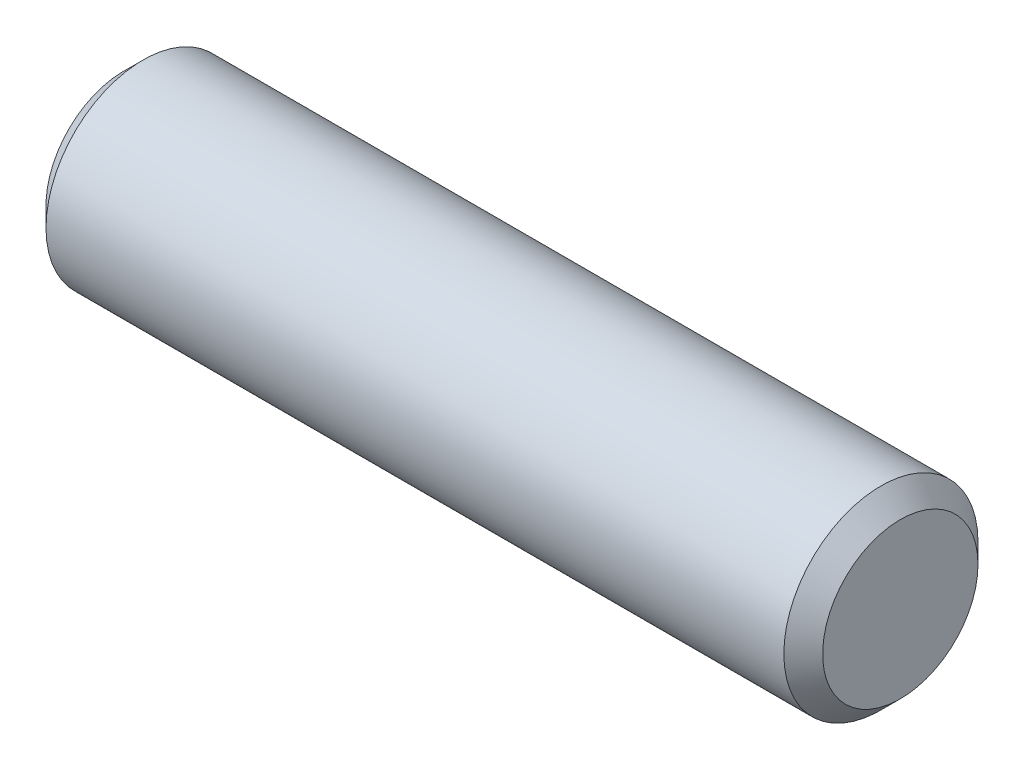
ISO-10303-21;
HEADER;
FILE_DESCRIPTION(('STEP AP214'),'2;1');
FILE_NAME('part.step','',(''),(''),'','','');
FILE_SCHEMA(('AUTOMOTIVE_DESIGN { 1 0 10303 214 1 1 1 1 }'));
ENDSEC;
DATA;
#1=APPLICATION_CONTEXT('core data for automotive mechanical design processes');
#2=APPLICATION_PROTOCOL_DEFINITION('international standard','automotive_design',2000,#1);
#3=PRODUCT_CONTEXT('',#1,'mechanical');
#4=PRODUCT('Part','Part','',(#3));
#5=PRODUCT_RELATED_PRODUCT_CATEGORY('part','',(#4));
#6=PRODUCT_DEFINITION_FORMATION('','',#4);
#7=PRODUCT_DEFINITION_CONTEXT('part definition',#1,'design');
#8=PRODUCT_DEFINITION('design','',#6,#7);
#9=PRODUCT_DEFINITION_SHAPE('','',#8);
#10=(LENGTH_UNIT() NAMED_UNIT(*) SI_UNIT(.MILLI.,.METRE.));
#11=(NAMED_UNIT(*) PLANE_ANGLE_UNIT() SI_UNIT($,.RADIAN.));
#12=(NAMED_UNIT(*) SI_UNIT($,.STERADIAN.) SOLID_ANGLE_UNIT());
#13=UNCERTAINTY_MEASURE_WITH_UNIT(LENGTH_MEASURE(1.E-05),#10,'distance_accuracy_value','');
#14=(GEOMETRIC_REPRESENTATION_CONTEXT(3) GLOBAL_UNCERTAINTY_ASSIGNED_CONTEXT((#13)) GLOBAL_UNIT_ASSIGNED_CONTEXT((#10,
#11,#12)) REPRESENTATION_CONTEXT('',''));
#15=CARTESIAN_POINT('',(0.,0.,0.));
#16=DIRECTION('',(0.,0.,1.));
#17=DIRECTION('',(1.,0.,0.));
#18=AXIS2_PLACEMENT_3D('',#15,#16,#17);
#19=CARTESIAN_POINT('',(-9.525,0.,0.));
#20=DIRECTION('',(1.,0.,0.));
#21=DIRECTION('',(0.,0.,-1.));
#22=AXIS2_PLACEMENT_3D('',#19,#20,#21);
#23=CYLINDRICAL_SURFACE('',#22,2.38125);
#24=CARTESIAN_POINT('',(9.04875000000001,0.,0.));
#25=DIRECTION('',(1.,0.,0.));
#26=DIRECTION('',(0.,0.,-1.));
#27=AXIS2_PLACEMENT_3D('',#24,#25,#26);
#28=CIRCLE('',#27,2.38125);
#29=CARTESIAN_POINT('',(9.04875,0.,-2.38125));
#30=VERTEX_POINT('',#29);
#31=EDGE_CURVE('E39',#30,#30,#28,.F.);
#32=CARTESIAN_POINT('',(-9.04875,0.,0.));
#33=DIRECTION('',(1.,0.,0.));
#34=DIRECTION('',(0.,0.,-1.));
#35=AXIS2_PLACEMENT_3D('',#32,#33,#34);
#36=CIRCLE('',#35,2.38125);
#37=CARTESIAN_POINT('',(-9.04875,0.,-2.38125));
#38=VERTEX_POINT('',#37);
#39=EDGE_CURVE('E43',#38,#38,#36,.T.);
#40=CARTESIAN_POINT('',(9.04875,0.,-2.38125));
#41=CARTESIAN_POINT('',(8.860234375,0.,-2.38125));
#42=CARTESIAN_POINT('',(8.67171875,0.,-2.38125));
#43=CARTESIAN_POINT('',(8.2946875,0.,-2.38125));
#44=CARTESIAN_POINT('',(8.106171875,0.,-2.38125));
#45=CARTESIAN_POINT('',(7.729140625,0.,-2.38125));
#46=CARTESIAN_POINT('',(7.540625,0.,-2.38125));
#47=CARTESIAN_POINT('',(7.16359375,0.,-2.38125));
#48=CARTESIAN_POINT('',(6.975078125,0.,-2.38125));
#49=CARTESIAN_POINT('',(6.598046875,0.,-2.38125));
#50=CARTESIAN_POINT('',(6.40953125,0.,-2.38125));
#51=CARTESIAN_POINT('',(6.0325,0.,-2.38125));
#52=CARTESIAN_POINT('',(5.843984375,0.,-2.38125));
#53=CARTESIAN_POINT('',(5.466953125,0.,-2.38125));
#54=CARTESIAN_POINT('',(5.2784375,0.,-2.38125));
#55=CARTESIAN_POINT('',(4.90140625,0.,-2.38125));
#56=CARTESIAN_POINT('',(4.712890625,0.,-2.38125));
#57=CARTESIAN_POINT('',(4.335859375,0.,-2.38125));
#58=CARTESIAN_POINT('',(4.14734375,0.,-2.38125));
#59=CARTESIAN_POINT('',(3.7703125,0.,-2.38125));
#60=CARTESIAN_POINT('',(3.581796875,0.,-2.38125));
#61=CARTESIAN_POINT('',(3.204765625,0.,-2.38125));
#62=CARTESIAN_POINT('',(3.01625,0.,-2.38125));
#63=CARTESIAN_POINT('',(2.63921875,0.,-2.38125));
#64=CARTESIAN_POINT('',(2.450703125,0.,-2.38125));
#65=CARTESIAN_POINT('',(2.073671875,0.,-2.38125));
#66=CARTESIAN_POINT('',(1.88515625,0.,-2.38125));
#67=CARTESIAN_POINT('',(1.508125,0.,-2.38125));
#68=CARTESIAN_POINT('',(1.319609375,0.,-2.38125));
#69=CARTESIAN_POINT('',(0.942578125000002,0.,-2.38125));
#70=CARTESIAN_POINT('',(0.754062500000002,0.,-2.38125));
#71=CARTESIAN_POINT('',(0.377031250000001,0.,-2.38125));
#72=CARTESIAN_POINT('',(0.188515625000002,0.,-2.38125));
#73=CARTESIAN_POINT('',(-0.188515624999998,0.,-2.38125));
#74=CARTESIAN_POINT('',(-0.377031249999998,0.,-2.38125));
#75=CARTESIAN_POINT('',(-0.754062499999998,0.,-2.38125));
#76=CARTESIAN_POINT('',(-0.942578124999999,0.,-2.38125));
#77=CARTESIAN_POINT('',(-1.319609375,0.,-2.38125));
#78=CARTESIAN_POINT('',(-1.508125,0.,-2.38125));
#79=CARTESIAN_POINT('',(-1.88515625,0.,-2.38125));
#80=CARTESIAN_POINT('',(-2.073671875,0.,-2.38125));
#81=CARTESIAN_POINT('',(-2.450703125,0.,-2.38125));
#82=CARTESIAN_POINT('',(-2.63921875,0.,-2.38125));
#83=CARTESIAN_POINT('',(-3.01625,0.,-2.38125));
#84=CARTESIAN_POINT('',(-3.204765625,0.,-2.38125));
#85=CARTESIAN_POINT('',(-3.581796875,0.,-2.38125));
#86=CARTESIAN_POINT('',(-3.7703125,0.,-2.38125));
#87=CARTESIAN_POINT('',(-4.14734375,0.,-2.38125));
#88=CARTESIAN_POINT('',(-4.335859375,0.,-2.38125));
#89=CARTESIAN_POINT('',(-4.712890625,0.,-2.38125));
#90=CARTESIAN_POINT('',(-4.90140625,0.,-2.38125));
#91=CARTESIAN_POINT('',(-5.2784375,0.,-2.38125));
#92=CARTESIAN_POINT('',(-5.466953125,0.,-2.38125));
#93=CARTESIAN_POINT('',(-5.843984375,0.,-2.38125));
#94=CARTESIAN_POINT('',(-6.0325,0.,-2.38125));
#95=CARTESIAN_POINT('',(-6.40953125,0.,-2.38125));
#96=CARTESIAN_POINT('',(-6.598046875,0.,-2.38125));
#97=CARTESIAN_POINT('',(-6.975078125,0.,-2.38125));
#98=CARTESIAN_POINT('',(-7.16359375,0.,-2.38125));
#99=CARTESIAN_POINT('',(-7.540625,0.,-2.38125));
#100=CARTESIAN_POINT('',(-7.729140625,0.,-2.38125));
#101=CARTESIAN_POINT('',(-8.106171875,0.,-2.38125));
#102=CARTESIAN_POINT('',(-8.2946875,0.,-2.38125));
#103=CARTESIAN_POINT('',(-8.67171875,0.,-2.38125));
#104=CARTESIAN_POINT('',(-8.860234375,0.,-2.38125));
#105=CARTESIAN_POINT('',(-9.04875,0.,-2.38125));
#106=B_SPLINE_CURVE_WITH_KNOTS('',3,(#40,#41,#42,#43,#44,#45,#46,#47,#48,#49,#50,#51,#52,#53,
#54,#55,#56,#57,#58,#59,#60,#61,#62,#63,#64,#65,#66,#67,#68,#69,#70,#71,#72,#73,#74,#75,#76,#77,
#78,#79,#80,#81,#82,#83,#84,#85,#86,#87,#88,#89,#90,#91,#92,#93,#94,#95,#96,#97,#98,#99,#100,
#101,#102,#103,#104,#105),.UNSPECIFIED.,.F.,.F.,(4,2,2,2,2,2,2,2,2,2,2,2,2,2,2,2,2,2,2,2,2,2,2,
2,2,2,2,2,2,2,2,2,4),(0.,0.565546875,1.13109375,1.696640625,2.2621875,2.827734375,3.39328125,
3.958828125,4.524375,5.089921875,5.65546875,6.221015625,6.7865625,7.352109375,7.91765625,
8.483203125,9.04875,9.614296875,10.17984375,10.745390625,11.3109375,11.876484375,12.44203125,
13.007578125,13.573125,14.138671875,14.70421875,15.269765625,15.8353125,16.400859375,
16.96640625,17.531953125,18.0975),.UNSPECIFIED.);
#107=EDGE_CURVE('BSEAM32',#30,#38,#106,.T.);
#108=ORIENTED_EDGE('',*,*,#31,.T.);
#109=ORIENTED_EDGE('',*,*,#39,.T.);
#110=ORIENTED_EDGE('',*,*,#107,.T.);
#111=ORIENTED_EDGE('',*,*,#107,.F.);
#112=EDGE_LOOP('',(#108,#110,#109,#111));
#113=FACE_BOUND('',#112,.T.);
#114=ADVANCED_FACE('F32',(#113),#23,.T.);
#115=CARTESIAN_POINT('',(-9.525,0.,0.));
#116=DIRECTION('',(1.,0.,0.));
#117=DIRECTION('',(0.,0.,-1.));
#118=AXIS2_PLACEMENT_3D('',#115,#116,#117);
#119=PLANE('',#118);
#120=CARTESIAN_POINT('',(-9.525,0.,0.));
#121=DIRECTION('',(1.,0.,0.));
#122=DIRECTION('',(0.,0.,-1.));
#123=AXIS2_PLACEMENT_3D('',#120,#121,#122);
#124=CIRCLE('',#123,1.905);
#125=CARTESIAN_POINT('',(-9.525,0.,-1.905));
#126=VERTEX_POINT('',#125);
#127=EDGE_CURVE('E10',#126,#126,#124,.F.);
#128=ORIENTED_EDGE('',*,*,#127,.T.);
#129=EDGE_LOOP('',(#128));
#130=FACE_BOUND('',#129,.T.);
#131=ADVANCED_FACE('F63',(#130),#119,.F.);
#132=CARTESIAN_POINT('',(9.525,0.,0.));
#133=DIRECTION('',(1.,0.,0.));
#134=DIRECTION('',(0.,0.,-1.));
#135=AXIS2_PLACEMENT_3D('',#132,#133,#134);
#136=PLANE('',#135);
#137=CARTESIAN_POINT('',(9.525,0.,0.));
#138=DIRECTION('',(1.,0.,0.));
#139=DIRECTION('',(0.,0.,-1.));
#140=AXIS2_PLACEMENT_3D('',#137,#138,#139);
#141=CIRCLE('',#140,1.905);
#142=CARTESIAN_POINT('',(9.525,0.,-1.905));
#143=VERTEX_POINT('',#142);
#144=EDGE_CURVE('E47',#143,#143,#141,.T.);
#145=ORIENTED_EDGE('',*,*,#144,.T.);
#146=EDGE_LOOP('',(#145));
#147=FACE_BOUND('',#146,.T.);
#148=ADVANCED_FACE('F53',(#147),#136,.T.);
#149=CARTESIAN_POINT('',(9.525,0.,0.));
#150=DIRECTION('',(-1.,0.,0.));
#151=DIRECTION('',(0.,0.,1.));
#152=AXIS2_PLACEMENT_3D('',#149,#150,#151);
#153=CONICAL_SURFACE('',#152,1.905,0.785398163397455);
#154=ORIENTED_EDGE('',*,*,#31,.F.);
#155=EDGE_LOOP('',(#154));
#156=FACE_BOUND('',#155,.T.);
#157=ORIENTED_EDGE('',*,*,#144,.F.);
#158=EDGE_LOOP('',(#157));
#159=FACE_BOUND('',#158,.T.);
#160=ADVANCED_FACE('F55',(#156,#159),#153,.T.);
#161=CARTESIAN_POINT('',(-9.04875,0.,0.));
#162=DIRECTION('',(1.,0.,0.));
#163=DIRECTION('',(0.,0.,-1.));
#164=AXIS2_PLACEMENT_3D('',#161,#162,#163);
#165=CONICAL_SURFACE('',#164,2.38125,0.785398163397451);
#166=CARTESIAN_POINT('',(-9.525,0.,-1.905));
#167=CARTESIAN_POINT('',(-9.5200390625,0.,-1.9099609375));
#168=CARTESIAN_POINT('',(-9.515078125,0.,-1.914921875));
#169=CARTESIAN_POINT('',(-9.50515625,0.,-1.92484375));
#170=CARTESIAN_POINT('',(-9.5001953125,0.,-1.9298046875));
#171=CARTESIAN_POINT('',(-9.4902734375,0.,-1.9397265625));
#172=CARTESIAN_POINT('',(-9.4853125,0.,-1.9446875));
#173=CARTESIAN_POINT('',(-9.475390625,0.,-1.954609375));
#174=CARTESIAN_POINT('',(-9.4704296875,0.,-1.9595703125));
#175=CARTESIAN_POINT('',(-9.4605078125,0.,-1.9694921875));
#176=CARTESIAN_POINT('',(-9.455546875,0.,-1.974453125));
#177=CARTESIAN_POINT('',(-9.445625,0.,-1.984375));
#178=CARTESIAN_POINT('',(-9.4406640625,0.,-1.9893359375));
#179=CARTESIAN_POINT('',(-9.4307421875,0.,-1.9992578125));
#180=CARTESIAN_POINT('',(-9.42578125,0.,-2.00421875));
#181=CARTESIAN_POINT('',(-9.415859375,0.,-2.014140625));
#182=CARTESIAN_POINT('',(-9.4108984375,0.,-2.0191015625));
#183=CARTESIAN_POINT('',(-9.4009765625,0.,-2.0290234375));
#184=CARTESIAN_POINT('',(-9.396015625,0.,-2.033984375));
#185=CARTESIAN_POINT('',(-9.38609375,0.,-2.04390625));
#186=CARTESIAN_POINT('',(-9.3811328125,0.,-2.0488671875));
#187=CARTESIAN_POINT('',(-9.3712109375,0.,-2.0587890625));
#188=CARTESIAN_POINT('',(-9.36625,0.,-2.06375));
#189=CARTESIAN_POINT('',(-9.356328125,0.,-2.073671875));
#190=CARTESIAN_POINT('',(-9.3513671875,0.,-2.0786328125));
#191=CARTESIAN_POINT('',(-9.3414453125,0.,-2.0885546875));
#192=CARTESIAN_POINT('',(-9.336484375,0.,-2.093515625));
#193=CARTESIAN_POINT('',(-9.3265625,0.,-2.1034375));
#194=CARTESIAN_POINT('',(-9.3216015625,0.,-2.1083984375));
#195=CARTESIAN_POINT('',(-9.3116796875,0.,-2.1183203125));
#196=CARTESIAN_POINT('',(-9.30671875,0.,-2.12328125));
#197=CARTESIAN_POINT('',(-9.296796875,0.,-2.133203125));
#198=CARTESIAN_POINT('',(-9.2918359375,0.,-2.1381640625));
#199=CARTESIAN_POINT('',(-9.2819140625,0.,-2.1480859375));
#200=CARTESIAN_POINT('',(-9.276953125,0.,-2.153046875));
#201=CARTESIAN_POINT('',(-9.26703125,0.,-2.16296875));
#202=CARTESIAN_POINT('',(-9.2620703125,0.,-2.1679296875));
#203=CARTESIAN_POINT('',(-9.2521484375,0.,-2.1778515625));
#204=CARTESIAN_POINT('',(-9.2471875,0.,-2.1828125));
#205=CARTESIAN_POINT('',(-9.237265625,0.,-2.192734375));
#206=CARTESIAN_POINT('',(-9.2323046875,0.,-2.1976953125));
#207=CARTESIAN_POINT('',(-9.2223828125,0.,-2.2076171875));
#208=CARTESIAN_POINT('',(-9.217421875,0.,-2.212578125));
#209=CARTESIAN_POINT('',(-9.2075,0.,-2.2225));
#210=CARTESIAN_POINT('',(-9.2025390625,0.,-2.2274609375));
#211=CARTESIAN_POINT('',(-9.1926171875,0.,-2.2373828125));
#212=CARTESIAN_POINT('',(-9.18765625,0.,-2.24234375));
#213=CARTESIAN_POINT('',(-9.177734375,0.,-2.252265625));
#214=CARTESIAN_POINT('',(-9.1727734375,0.,-2.2572265625));
#215=CARTESIAN_POINT('',(-9.1628515625,0.,-2.2671484375));
#216=CARTESIAN_POINT('',(-9.157890625,0.,-2.272109375));
#217=CARTESIAN_POINT('',(-9.14796875,0.,-2.28203125));
#218=CARTESIAN_POINT('',(-9.1430078125,0.,-2.2869921875));
#219=CARTESIAN_POINT('',(-9.1330859375,0.,-2.2969140625));
#220=CARTESIAN_POINT('',(-9.128125,0.,-2.301875));
#221=CARTESIAN_POINT('',(-9.118203125,0.,-2.311796875));
#222=CARTESIAN_POINT('',(-9.1132421875,0.,-2.3167578125));
#223=CARTESIAN_POINT('',(-9.1033203125,0.,-2.3266796875));
#224=CARTESIAN_POINT('',(-9.098359375,0.,-2.331640625));
#225=CARTESIAN_POINT('',(-9.0884375,0.,-2.3415625));
#226=CARTESIAN_POINT('',(-9.0834765625,0.,-2.3465234375));
#227=CARTESIAN_POINT('',(-9.0735546875,0.,-2.3564453125));
#228=CARTESIAN_POINT('',(-9.06859375,0.,-2.36140625));
#229=CARTESIAN_POINT('',(-9.058671875,0.,-2.371328125));
#230=CARTESIAN_POINT('',(-9.0537109375,0.,-2.3762890625));
#231=CARTESIAN_POINT('',(-9.04875,0.,-2.38125));
#232=B_SPLINE_CURVE_WITH_KNOTS('',3,(#166,#167,#168,#169,#170,#171,#172,#173,#174,#175,#176,
#177,#178,#179,#180,#181,#182,#183,#184,#185,#186,#187,#188,#189,#190,#191,#192,#193,#194,#195,
#196,#197,#198,#199,#200,#201,#202,#203,#204,#205,#206,#207,#208,#209,#210,#211,#212,#213,#214,
#215,#216,#217,#218,#219,#220,#221,#222,#223,#224,#225,#226,#227,#228,#229,#230,#231),
.UNSPECIFIED.,.F.,.F.,(4,2,2,2,2,2,2,2,2,2,2,2,2,2,2,2,2,2,2,2,2,2,2,2,2,2,2,2,2,2,2,2,4),(0.,
0.021047475283755,0.0420949505675111,0.0631424258512672,0.0841899011350235,0.10523737641878,
0.126284851702535,0.147332326986291,0.168379802270047,0.189427277553803,0.210474752837559,
0.231522228121314,0.25256970340507,0.273617178688826,0.294664653972583,0.315712129256339,
0.336759604540095,0.35780707982385,0.378854555107606,0.399902030391362,0.420949505675118,
0.441996980958874,0.463044456242629,0.484091931526386,0.505139406810141,0.526186882093898,
0.547234357377654,0.568281832661409,0.589329307945165,0.610376783228921,0.631424258512677,
0.652471733796434,0.673519209080189),.UNSPECIFIED.);
#233=EDGE_CURVE('BSEAM34',#126,#38,#232,.T.);
#234=ORIENTED_EDGE('',*,*,#127,.F.);
#235=ORIENTED_EDGE('',*,*,#39,.F.);
#236=ORIENTED_EDGE('',*,*,#233,.T.);
#237=ORIENTED_EDGE('',*,*,#233,.F.);
#238=EDGE_LOOP('',(#234,#236,#235,#237));
#239=FACE_BOUND('',#238,.T.);
#240=ADVANCED_FACE('F34',(#239),#165,.T.);
#241=CLOSED_SHELL('',(#114,#131,#148,#160,#240));
#242=MANIFOLD_SOLID_BREP('B2',#241);
#243=ADVANCED_BREP_SHAPE_REPRESENTATION('',(#18,#242),#14);
#244=SHAPE_DEFINITION_REPRESENTATION(#9,#243);
ENDSEC;
END-ISO-10303-21;
